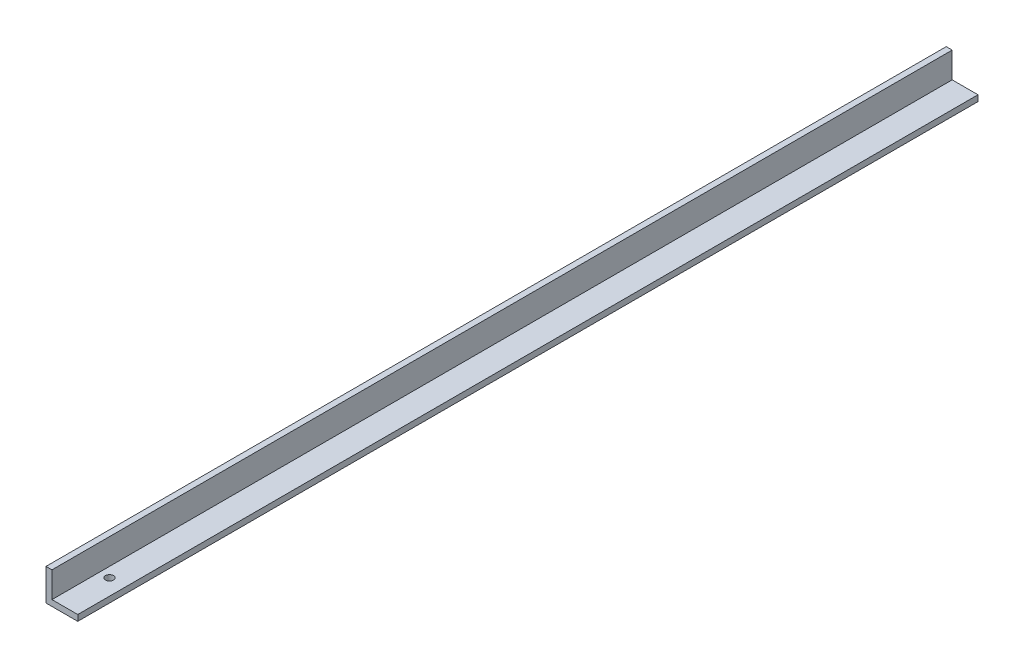
ISO-10303-21;
HEADER;
FILE_DESCRIPTION(('STEP AP214'),'2;1');
FILE_NAME('part.step','',(''),(''),'','','');
FILE_SCHEMA(('AUTOMOTIVE_DESIGN { 1 0 10303 214 1 1 1 1 }'));
ENDSEC;
DATA;
#1=APPLICATION_CONTEXT('core data for automotive mechanical design processes');
#2=APPLICATION_PROTOCOL_DEFINITION('international standard','automotive_design',2000,#1);
#3=PRODUCT_CONTEXT('',#1,'mechanical');
#4=PRODUCT('Part','Part','',(#3));
#5=PRODUCT_RELATED_PRODUCT_CATEGORY('part','',(#4));
#6=PRODUCT_DEFINITION_FORMATION('','',#4);
#7=PRODUCT_DEFINITION_CONTEXT('part definition',#1,'design');
#8=PRODUCT_DEFINITION('design','',#6,#7);
#9=PRODUCT_DEFINITION_SHAPE('','',#8);
#10=(LENGTH_UNIT() NAMED_UNIT(*) SI_UNIT(.MILLI.,.METRE.));
#11=(NAMED_UNIT(*) PLANE_ANGLE_UNIT() SI_UNIT($,.RADIAN.));
#12=(NAMED_UNIT(*) SI_UNIT($,.STERADIAN.) SOLID_ANGLE_UNIT());
#13=UNCERTAINTY_MEASURE_WITH_UNIT(LENGTH_MEASURE(1.E-05),#10,'distance_accuracy_value','');
#14=(GEOMETRIC_REPRESENTATION_CONTEXT(3) GLOBAL_UNCERTAINTY_ASSIGNED_CONTEXT((#13)) GLOBAL_UNIT_ASSIGNED_CONTEXT((#10,
#11,#12)) REPRESENTATION_CONTEXT('',''));
#15=CARTESIAN_POINT('',(0.,0.,0.));
#16=DIRECTION('',(0.,0.,1.));
#17=DIRECTION('',(1.,0.,0.));
#18=AXIS2_PLACEMENT_3D('',#15,#16,#17);
#19=CARTESIAN_POINT('',(-4.7625,0.,720.09));
#20=DIRECTION('',(0.,-1.,0.));
#21=DIRECTION('',(0.,0.,-1.));
#22=AXIS2_PLACEMENT_3D('',#19,#20,#21);
#23=PLANE('',#22);
#24=DIRECTION('',(-1.,0.,0.));
#25=VECTOR('',#24,1.);
#26=CARTESIAN_POINT('',(-4.7625,0.,0.));
#27=LINE('',#26,#25);
#28=CARTESIAN_POINT('',(0.,0.,0.));
#29=VERTEX_POINT('',#28);
#30=CARTESIAN_POINT('',(-4.7625,0.,0.));
#31=VERTEX_POINT('',#30);
#32=EDGE_CURVE('E117',#29,#31,#27,.T.);
#33=ORIENTED_EDGE('',*,*,#32,.T.);
#34=DIRECTION('',(0.,0.,-1.));
#35=VECTOR('',#34,1.);
#36=CARTESIAN_POINT('',(-4.7625,0.,720.09));
#37=LINE('',#36,#35);
#38=CARTESIAN_POINT('',(-4.7625,0.,720.09));
#39=VERTEX_POINT('',#38);
#40=EDGE_CURVE('E11',#39,#31,#37,.T.);
#41=ORIENTED_EDGE('',*,*,#40,.F.);
#42=DIRECTION('',(-1.,0.,0.));
#43=VECTOR('',#42,1.);
#44=CARTESIAN_POINT('',(-4.7625,0.,720.09));
#45=LINE('',#44,#43);
#46=CARTESIAN_POINT('',(0.,0.,720.09));
#47=VERTEX_POINT('',#46);
#48=EDGE_CURVE('E128',#47,#39,#45,.T.);
#49=ORIENTED_EDGE('',*,*,#48,.F.);
#50=DIRECTION('',(0.,0.,-1.));
#51=VECTOR('',#50,1.);
#52=CARTESIAN_POINT('',(0.,0.,720.09));
#53=LINE('',#52,#51);
#54=EDGE_CURVE('E113',#47,#29,#53,.T.);
#55=ORIENTED_EDGE('',*,*,#54,.T.);
#56=EDGE_LOOP('',(#33,#41,#49,#55));
#57=FACE_BOUND('',#56,.T.);
#58=ADVANCED_FACE('F33',(#57),#23,.F.);
#59=CARTESIAN_POINT('',(-4.7625,0.,720.09));
#60=DIRECTION('',(1.,0.,0.));
#61=DIRECTION('',(0.,1.,0.));
#62=AXIS2_PLACEMENT_3D('',#59,#60,#61);
#63=PLANE('',#62);
#64=DIRECTION('',(0.,-1.,0.));
#65=VECTOR('',#64,1.);
#66=CARTESIAN_POINT('',(-4.7625,0.,0.));
#67=LINE('',#66,#65);
#68=CARTESIAN_POINT('',(-4.7625,-25.4,0.));
#69=VERTEX_POINT('',#68);
#70=EDGE_CURVE('E120',#31,#69,#67,.T.);
#71=ORIENTED_EDGE('',*,*,#70,.T.);
#72=DIRECTION('',(0.,0.,-1.));
#73=VECTOR('',#72,1.);
#74=CARTESIAN_POINT('',(-4.7625,-25.4,720.09));
#75=LINE('',#74,#73);
#76=CARTESIAN_POINT('',(-4.7625,-25.4,720.09));
#77=VERTEX_POINT('',#76);
#78=EDGE_CURVE('E41',#77,#69,#75,.T.);
#79=ORIENTED_EDGE('',*,*,#78,.F.);
#80=DIRECTION('',(0.,-1.,0.));
#81=VECTOR('',#80,1.);
#82=CARTESIAN_POINT('',(-4.7625,0.,720.09));
#83=LINE('',#82,#81);
#84=EDGE_CURVE('E86',#39,#77,#83,.T.);
#85=ORIENTED_EDGE('',*,*,#84,.F.);
#86=ORIENTED_EDGE('',*,*,#40,.T.);
#87=EDGE_LOOP('',(#71,#79,#85,#86));
#88=FACE_BOUND('',#87,.T.);
#89=ADVANCED_FACE('F153',(#88),#63,.F.);
#90=CARTESIAN_POINT('',(-4.7625,-25.4,720.09));
#91=DIRECTION('',(0.,1.,0.));
#92=DIRECTION('',(0.,0.,1.));
#93=AXIS2_PLACEMENT_3D('',#90,#91,#92);
#94=PLANE('',#93);
#95=CARTESIAN_POINT('',(7.9375,-25.4,681.99));
#96=DIRECTION('',(0.,1.,0.));
#97=DIRECTION('',(0.,0.,1.));
#98=AXIS2_PLACEMENT_3D('',#95,#96,#97);
#99=CIRCLE('',#98,3.175);
#100=CARTESIAN_POINT('',(7.9375,-25.4,685.165));
#101=VERTEX_POINT('',#100);
#102=EDGE_CURVE('E121',#101,#101,#99,.F.);
#103=ORIENTED_EDGE('',*,*,#102,.F.);
#104=EDGE_LOOP('',(#103));
#105=FACE_BOUND('',#104,.T.);
#106=DIRECTION('',(1.,0.,0.));
#107=VECTOR('',#106,1.);
#108=CARTESIAN_POINT('',(-4.7625,-25.4,0.));
#109=LINE('',#108,#107);
#110=CARTESIAN_POINT('',(20.6375,-25.4,0.));
#111=VERTEX_POINT('',#110);
#112=EDGE_CURVE('E123',#69,#111,#109,.T.);
#113=ORIENTED_EDGE('',*,*,#112,.T.);
#114=DIRECTION('',(0.,0.,-1.));
#115=VECTOR('',#114,1.);
#116=CARTESIAN_POINT('',(20.6375,-25.4,720.09));
#117=LINE('',#116,#115);
#118=CARTESIAN_POINT('',(20.6375,-25.4,720.09));
#119=VERTEX_POINT('',#118);
#120=EDGE_CURVE('E108',#119,#111,#117,.T.);
#121=ORIENTED_EDGE('',*,*,#120,.F.);
#122=DIRECTION('',(1.,0.,0.));
#123=VECTOR('',#122,1.);
#124=CARTESIAN_POINT('',(-4.7625,-25.4,720.09));
#125=LINE('',#124,#123);
#126=EDGE_CURVE('E99',#77,#119,#125,.T.);
#127=ORIENTED_EDGE('',*,*,#126,.F.);
#128=ORIENTED_EDGE('',*,*,#78,.T.);
#129=EDGE_LOOP('',(#113,#121,#127,#128));
#130=FACE_BOUND('',#129,.T.);
#131=ADVANCED_FACE('F134',(#105,#130),#94,.F.);
#132=CARTESIAN_POINT('',(20.6375,-20.6375,720.09));
#133=DIRECTION('',(-1.,0.,0.));
#134=DIRECTION('',(0.,0.,1.));
#135=AXIS2_PLACEMENT_3D('',#132,#133,#134);
#136=PLANE('',#135);
#137=DIRECTION('',(0.,1.,0.));
#138=VECTOR('',#137,1.);
#139=CARTESIAN_POINT('',(20.6375,-20.6375,0.));
#140=LINE('',#139,#138);
#141=CARTESIAN_POINT('',(20.6375,-20.6375,0.));
#142=VERTEX_POINT('',#141);
#143=EDGE_CURVE('E107',#111,#142,#140,.T.);
#144=ORIENTED_EDGE('',*,*,#143,.T.);
#145=DIRECTION('',(0.,0.,-1.));
#146=VECTOR('',#145,1.);
#147=CARTESIAN_POINT('',(20.6375,-20.6375,720.09));
#148=LINE('',#147,#146);
#149=CARTESIAN_POINT('',(20.6375,-20.6375,720.09));
#150=VERTEX_POINT('',#149);
#151=EDGE_CURVE('E104',#150,#142,#148,.T.);
#152=ORIENTED_EDGE('',*,*,#151,.F.);
#153=DIRECTION('',(0.,1.,0.));
#154=VECTOR('',#153,1.);
#155=CARTESIAN_POINT('',(20.6375,-20.6375,720.09));
#156=LINE('',#155,#154);
#157=EDGE_CURVE('E93',#119,#150,#156,.T.);
#158=ORIENTED_EDGE('',*,*,#157,.F.);
#159=ORIENTED_EDGE('',*,*,#120,.T.);
#160=EDGE_LOOP('',(#144,#152,#158,#159));
#161=FACE_BOUND('',#160,.T.);
#162=ADVANCED_FACE('F105',(#161),#136,.F.);
#163=CARTESIAN_POINT('',(0.,-20.6375,720.09));
#164=DIRECTION('',(0.,-1.,0.));
#165=DIRECTION('',(0.,0.,-1.));
#166=AXIS2_PLACEMENT_3D('',#163,#164,#165);
#167=PLANE('',#166);
#168=CARTESIAN_POINT('',(7.9375,-20.6375,681.99));
#169=DIRECTION('',(0.,1.,0.));
#170=DIRECTION('',(0.,0.,1.));
#171=AXIS2_PLACEMENT_3D('',#168,#169,#170);
#172=CIRCLE('',#171,3.175);
#173=CARTESIAN_POINT('',(7.9375,-20.6375,685.165));
#174=VERTEX_POINT('',#173);
#175=EDGE_CURVE('E208',#174,#174,#172,.T.);
#176=ORIENTED_EDGE('',*,*,#175,.F.);
#177=EDGE_LOOP('',(#176));
#178=FACE_BOUND('',#177,.T.);
#179=DIRECTION('',(-1.,0.,0.));
#180=VECTOR('',#179,1.);
#181=CARTESIAN_POINT('',(0.,-20.6375,0.));
#182=LINE('',#181,#180);
#183=CARTESIAN_POINT('',(0.,-20.6375,0.));
#184=VERTEX_POINT('',#183);
#185=EDGE_CURVE('E72',#142,#184,#182,.T.);
#186=ORIENTED_EDGE('',*,*,#185,.T.);
#187=DIRECTION('',(0.,0.,-1.));
#188=VECTOR('',#187,1.);
#189=CARTESIAN_POINT('',(0.,-20.6375,720.09));
#190=LINE('',#189,#188);
#191=CARTESIAN_POINT('',(0.,-20.6375,720.09));
#192=VERTEX_POINT('',#191);
#193=EDGE_CURVE('E109',#192,#184,#190,.T.);
#194=ORIENTED_EDGE('',*,*,#193,.F.);
#195=DIRECTION('',(-1.,0.,0.));
#196=VECTOR('',#195,1.);
#197=CARTESIAN_POINT('',(0.,-20.6375,720.09));
#198=LINE('',#197,#196);
#199=EDGE_CURVE('E97',#150,#192,#198,.T.);
#200=ORIENTED_EDGE('',*,*,#199,.F.);
#201=ORIENTED_EDGE('',*,*,#151,.T.);
#202=EDGE_LOOP('',(#186,#194,#200,#201));
#203=FACE_BOUND('',#202,.T.);
#204=ADVANCED_FACE('F111',(#178,#203),#167,.F.);
#205=CARTESIAN_POINT('',(0.,0.,720.09));
#206=DIRECTION('',(-1.,0.,0.));
#207=DIRECTION('',(0.,-1.,0.));
#208=AXIS2_PLACEMENT_3D('',#205,#206,#207);
#209=PLANE('',#208);
#210=DIRECTION('',(0.,1.,0.));
#211=VECTOR('',#210,1.);
#212=CARTESIAN_POINT('',(0.,0.,0.));
#213=LINE('',#212,#211);
#214=EDGE_CURVE('E78',#184,#29,#213,.T.);
#215=ORIENTED_EDGE('',*,*,#214,.T.);
#216=ORIENTED_EDGE('',*,*,#54,.F.);
#217=DIRECTION('',(0.,1.,0.));
#218=VECTOR('',#217,1.);
#219=CARTESIAN_POINT('',(0.,0.,720.09));
#220=LINE('',#219,#218);
#221=EDGE_CURVE('E49',#192,#47,#220,.T.);
#222=ORIENTED_EDGE('',*,*,#221,.F.);
#223=ORIENTED_EDGE('',*,*,#193,.T.);
#224=EDGE_LOOP('',(#215,#216,#222,#223));
#225=FACE_BOUND('',#224,.T.);
#226=ADVANCED_FACE('F141',(#225),#209,.F.);
#227=CARTESIAN_POINT('',(0.,0.,720.09));
#228=DIRECTION('',(0.,0.,-1.));
#229=DIRECTION('',(-1.,0.,0.));
#230=AXIS2_PLACEMENT_3D('',#227,#228,#229);
#231=PLANE('',#230);
#232=ORIENTED_EDGE('',*,*,#48,.T.);
#233=ORIENTED_EDGE('',*,*,#84,.T.);
#234=ORIENTED_EDGE('',*,*,#126,.T.);
#235=ORIENTED_EDGE('',*,*,#157,.T.);
#236=ORIENTED_EDGE('',*,*,#199,.T.);
#237=ORIENTED_EDGE('',*,*,#221,.T.);
#238=EDGE_LOOP('',(#232,#233,#234,#235,#236,#237));
#239=FACE_BOUND('',#238,.T.);
#240=ADVANCED_FACE('F95',(#239),#231,.F.);
#241=CARTESIAN_POINT('',(0.,0.,0.));
#242=DIRECTION('',(0.,0.,-1.));
#243=DIRECTION('',(-1.,0.,0.));
#244=AXIS2_PLACEMENT_3D('',#241,#242,#243);
#245=PLANE('',#244);
#246=ORIENTED_EDGE('',*,*,#32,.F.);
#247=ORIENTED_EDGE('',*,*,#214,.F.);
#248=ORIENTED_EDGE('',*,*,#185,.F.);
#249=ORIENTED_EDGE('',*,*,#143,.F.);
#250=ORIENTED_EDGE('',*,*,#112,.F.);
#251=ORIENTED_EDGE('',*,*,#70,.F.);
#252=EDGE_LOOP('',(#246,#247,#248,#249,#250,#251));
#253=FACE_BOUND('',#252,.T.);
#254=ADVANCED_FACE('F137',(#253),#245,.T.);
#255=CARTESIAN_POINT('',(7.9375,-25.401,681.99));
#256=DIRECTION('',(0.,1.,0.));
#257=DIRECTION('',(0.,0.,1.));
#258=AXIS2_PLACEMENT_3D('',#255,#256,#257);
#259=CYLINDRICAL_SURFACE('',#258,3.175);
#260=ORIENTED_EDGE('',*,*,#175,.T.);
#261=EDGE_LOOP('',(#260));
#262=FACE_BOUND('',#261,.T.);
#263=ORIENTED_EDGE('',*,*,#102,.T.);
#264=EDGE_LOOP('',(#263));
#265=FACE_BOUND('',#264,.T.);
#266=ADVANCED_FACE('F181',(#262,#265),#259,.F.);
#267=CLOSED_SHELL('',(#58,#89,#131,#162,#204,#226,#240,#254,#266));
#268=MANIFOLD_SOLID_BREP('B2',#267);
#269=ADVANCED_BREP_SHAPE_REPRESENTATION('',(#18,#268),#14);
#270=SHAPE_DEFINITION_REPRESENTATION(#9,#269);
ENDSEC;
END-ISO-10303-21;
